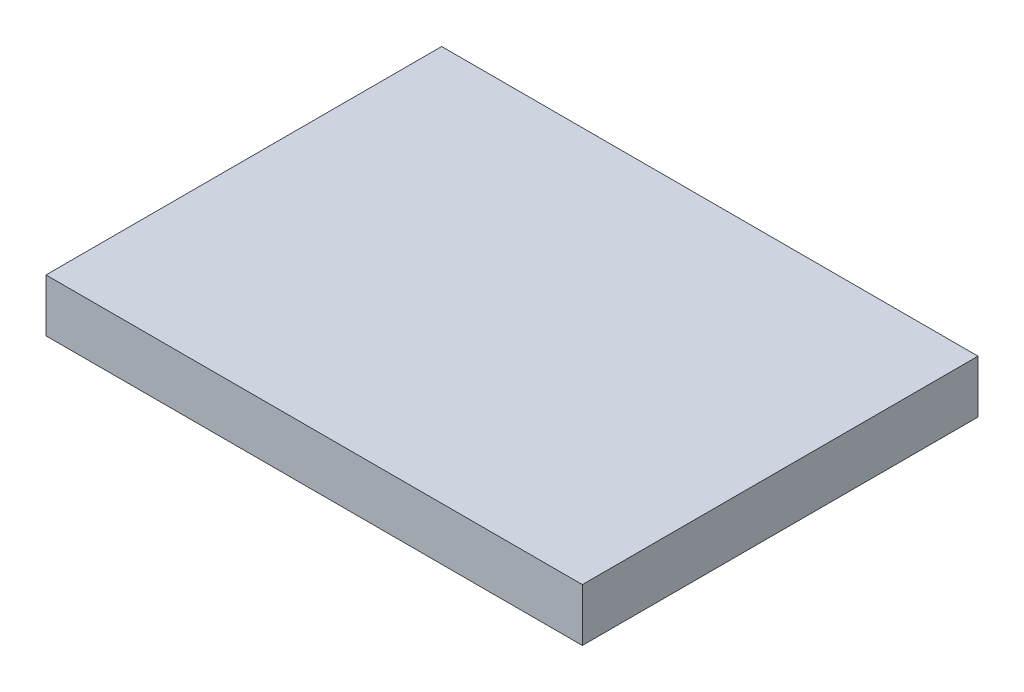
ISO-10303-21;
HEADER;
FILE_DESCRIPTION(('STEP AP214'),'2;1');
FILE_NAME('part.step','',(''),(''),'','','');
FILE_SCHEMA(('AUTOMOTIVE_DESIGN { 1 0 10303 214 1 1 1 1 }'));
ENDSEC;
DATA;
#1=APPLICATION_CONTEXT('core data for automotive mechanical design processes');
#2=APPLICATION_PROTOCOL_DEFINITION('international standard','automotive_design',2000,#1);
#3=PRODUCT_CONTEXT('',#1,'mechanical');
#4=PRODUCT('Part','Part','',(#3));
#5=PRODUCT_RELATED_PRODUCT_CATEGORY('part','',(#4));
#6=PRODUCT_DEFINITION_FORMATION('','',#4);
#7=PRODUCT_DEFINITION_CONTEXT('part definition',#1,'design');
#8=PRODUCT_DEFINITION('design','',#6,#7);
#9=PRODUCT_DEFINITION_SHAPE('','',#8);
#10=(LENGTH_UNIT() NAMED_UNIT(*) SI_UNIT(.MILLI.,.METRE.));
#11=(NAMED_UNIT(*) PLANE_ANGLE_UNIT() SI_UNIT($,.RADIAN.));
#12=(NAMED_UNIT(*) SI_UNIT($,.STERADIAN.) SOLID_ANGLE_UNIT());
#13=UNCERTAINTY_MEASURE_WITH_UNIT(LENGTH_MEASURE(1.E-05),#10,'distance_accuracy_value','');
#14=(GEOMETRIC_REPRESENTATION_CONTEXT(3) GLOBAL_UNCERTAINTY_ASSIGNED_CONTEXT((#13)) GLOBAL_UNIT_ASSIGNED_CONTEXT((#10,
#11,#12)) REPRESENTATION_CONTEXT('',''));
#15=CARTESIAN_POINT('',(0.,0.,0.));
#16=DIRECTION('',(0.,0.,1.));
#17=DIRECTION('',(1.,0.,0.));
#18=AXIS2_PLACEMENT_3D('',#15,#16,#17);
#19=CARTESIAN_POINT('',(30.5,6.,22.5));
#20=DIRECTION('',(-1.,0.,0.));
#21=DIRECTION('',(0.,0.,1.));
#22=AXIS2_PLACEMENT_3D('',#19,#20,#21);
#23=PLANE('',#22);
#24=DIRECTION('',(0.,0.,-1.));
#25=VECTOR('',#24,1.);
#26=CARTESIAN_POINT('',(30.5,0.,22.5));
#27=LINE('',#26,#25);
#28=CARTESIAN_POINT('',(30.5,0.,22.5));
#29=VERTEX_POINT('',#28);
#30=CARTESIAN_POINT('',(30.5,0.,-22.5));
#31=VERTEX_POINT('',#30);
#32=EDGE_CURVE('E96',#29,#31,#27,.T.);
#33=ORIENTED_EDGE('',*,*,#32,.T.);
#34=DIRECTION('',(0.,-1.,0.));
#35=VECTOR('',#34,1.);
#36=CARTESIAN_POINT('',(30.5,6.,-22.5));
#37=LINE('',#36,#35);
#38=CARTESIAN_POINT('',(30.5,6.,-22.5));
#39=VERTEX_POINT('',#38);
#40=EDGE_CURVE('E11',#39,#31,#37,.T.);
#41=ORIENTED_EDGE('',*,*,#40,.F.);
#42=DIRECTION('',(0.,0.,-1.));
#43=VECTOR('',#42,1.);
#44=CARTESIAN_POINT('',(30.5,6.,22.5));
#45=LINE('',#44,#43);
#46=CARTESIAN_POINT('',(30.5,6.,22.5));
#47=VERTEX_POINT('',#46);
#48=EDGE_CURVE('E84',#47,#39,#45,.T.);
#49=ORIENTED_EDGE('',*,*,#48,.F.);
#50=DIRECTION('',(0.,-1.,0.));
#51=VECTOR('',#50,1.);
#52=CARTESIAN_POINT('',(30.5,6.,22.5));
#53=LINE('',#52,#51);
#54=EDGE_CURVE('E92',#47,#29,#53,.T.);
#55=ORIENTED_EDGE('',*,*,#54,.T.);
#56=EDGE_LOOP('',(#33,#41,#49,#55));
#57=FACE_BOUND('',#56,.T.);
#58=ADVANCED_FACE('F33',(#57),#23,.F.);
#59=CARTESIAN_POINT('',(-30.5,6.,-22.5));
#60=DIRECTION('',(0.,0.,1.));
#61=DIRECTION('',(1.,0.,0.));
#62=AXIS2_PLACEMENT_3D('',#59,#60,#61);
#63=PLANE('',#62);
#64=DIRECTION('',(-1.,0.,0.));
#65=VECTOR('',#64,1.);
#66=CARTESIAN_POINT('',(-30.5,0.,-22.5));
#67=LINE('',#66,#65);
#68=CARTESIAN_POINT('',(-30.5,0.,-22.5));
#69=VERTEX_POINT('',#68);
#70=EDGE_CURVE('E88',#31,#69,#67,.T.);
#71=ORIENTED_EDGE('',*,*,#70,.T.);
#72=DIRECTION('',(0.,-1.,0.));
#73=VECTOR('',#72,1.);
#74=CARTESIAN_POINT('',(-30.5,6.,-22.5));
#75=LINE('',#74,#73);
#76=CARTESIAN_POINT('',(-30.5,6.,-22.5));
#77=VERTEX_POINT('',#76);
#78=EDGE_CURVE('E41',#77,#69,#75,.T.);
#79=ORIENTED_EDGE('',*,*,#78,.F.);
#80=DIRECTION('',(-1.,0.,0.));
#81=VECTOR('',#80,1.);
#82=CARTESIAN_POINT('',(-30.5,6.,-22.5));
#83=LINE('',#82,#81);
#84=EDGE_CURVE('E79',#39,#77,#83,.T.);
#85=ORIENTED_EDGE('',*,*,#84,.F.);
#86=ORIENTED_EDGE('',*,*,#40,.T.);
#87=EDGE_LOOP('',(#71,#79,#85,#86));
#88=FACE_BOUND('',#87,.T.);
#89=ADVANCED_FACE('F87',(#88),#63,.F.);
#90=CARTESIAN_POINT('',(-30.5,6.,22.5));
#91=DIRECTION('',(1.,0.,0.));
#92=DIRECTION('',(0.,0.,-1.));
#93=AXIS2_PLACEMENT_3D('',#90,#91,#92);
#94=PLANE('',#93);
#95=DIRECTION('',(0.,0.,1.));
#96=VECTOR('',#95,1.);
#97=CARTESIAN_POINT('',(-30.5,0.,22.5));
#98=LINE('',#97,#96);
#99=CARTESIAN_POINT('',(-30.5,0.,22.5));
#100=VERTEX_POINT('',#99);
#101=EDGE_CURVE('E66',#69,#100,#98,.T.);
#102=ORIENTED_EDGE('',*,*,#101,.T.);
#103=DIRECTION('',(0.,-1.,0.));
#104=VECTOR('',#103,1.);
#105=CARTESIAN_POINT('',(-30.5,6.,22.5));
#106=LINE('',#105,#104);
#107=CARTESIAN_POINT('',(-30.5,6.,22.5));
#108=VERTEX_POINT('',#107);
#109=EDGE_CURVE('E89',#108,#100,#106,.T.);
#110=ORIENTED_EDGE('',*,*,#109,.F.);
#111=DIRECTION('',(0.,0.,1.));
#112=VECTOR('',#111,1.);
#113=CARTESIAN_POINT('',(-30.5,6.,22.5));
#114=LINE('',#113,#112);
#115=EDGE_CURVE('E82',#77,#108,#114,.T.);
#116=ORIENTED_EDGE('',*,*,#115,.F.);
#117=ORIENTED_EDGE('',*,*,#78,.T.);
#118=EDGE_LOOP('',(#102,#110,#116,#117));
#119=FACE_BOUND('',#118,.T.);
#120=ADVANCED_FACE('F90',(#119),#94,.F.);
#121=CARTESIAN_POINT('',(-30.5,6.,22.5));
#122=DIRECTION('',(0.,0.,-1.));
#123=DIRECTION('',(-1.,0.,0.));
#124=AXIS2_PLACEMENT_3D('',#121,#122,#123);
#125=PLANE('',#124);
#126=DIRECTION('',(1.,0.,0.));
#127=VECTOR('',#126,1.);
#128=CARTESIAN_POINT('',(-30.5,0.,22.5));
#129=LINE('',#128,#127);
#130=EDGE_CURVE('E72',#100,#29,#129,.T.);
#131=ORIENTED_EDGE('',*,*,#130,.T.);
#132=ORIENTED_EDGE('',*,*,#54,.F.);
#133=DIRECTION('',(1.,0.,0.));
#134=VECTOR('',#133,1.);
#135=CARTESIAN_POINT('',(-30.5,6.,22.5));
#136=LINE('',#135,#134);
#137=EDGE_CURVE('E49',#108,#47,#136,.T.);
#138=ORIENTED_EDGE('',*,*,#137,.F.);
#139=ORIENTED_EDGE('',*,*,#109,.T.);
#140=EDGE_LOOP('',(#131,#132,#138,#139));
#141=FACE_BOUND('',#140,.T.);
#142=ADVANCED_FACE('F103',(#141),#125,.F.);
#143=CARTESIAN_POINT('',(0.,6.,0.));
#144=DIRECTION('',(0.,-1.,0.));
#145=DIRECTION('',(0.,0.,-1.));
#146=AXIS2_PLACEMENT_3D('',#143,#144,#145);
#147=PLANE('',#146);
#148=ORIENTED_EDGE('',*,*,#48,.T.);
#149=ORIENTED_EDGE('',*,*,#84,.T.);
#150=ORIENTED_EDGE('',*,*,#115,.T.);
#151=ORIENTED_EDGE('',*,*,#137,.T.);
#152=EDGE_LOOP('',(#148,#149,#150,#151));
#153=FACE_BOUND('',#152,.T.);
#154=ADVANCED_FACE('F80',(#153),#147,.F.);
#155=CARTESIAN_POINT('',(0.,0.,0.));
#156=DIRECTION('',(0.,-1.,0.));
#157=DIRECTION('',(0.,0.,-1.));
#158=AXIS2_PLACEMENT_3D('',#155,#156,#157);
#159=PLANE('',#158);
#160=ORIENTED_EDGE('',*,*,#32,.F.);
#161=ORIENTED_EDGE('',*,*,#130,.F.);
#162=ORIENTED_EDGE('',*,*,#101,.F.);
#163=ORIENTED_EDGE('',*,*,#70,.F.);
#164=EDGE_LOOP('',(#160,#161,#162,#163));
#165=FACE_BOUND('',#164,.T.);
#166=ADVANCED_FACE('F106',(#165),#159,.T.);
#167=CLOSED_SHELL('',(#58,#89,#120,#142,#154,#166));
#168=MANIFOLD_SOLID_BREP('B2',#167);
#169=ADVANCED_BREP_SHAPE_REPRESENTATION('',(#18,#168),#14);
#170=SHAPE_DEFINITION_REPRESENTATION(#9,#169);
ENDSEC;
END-ISO-10303-21;
